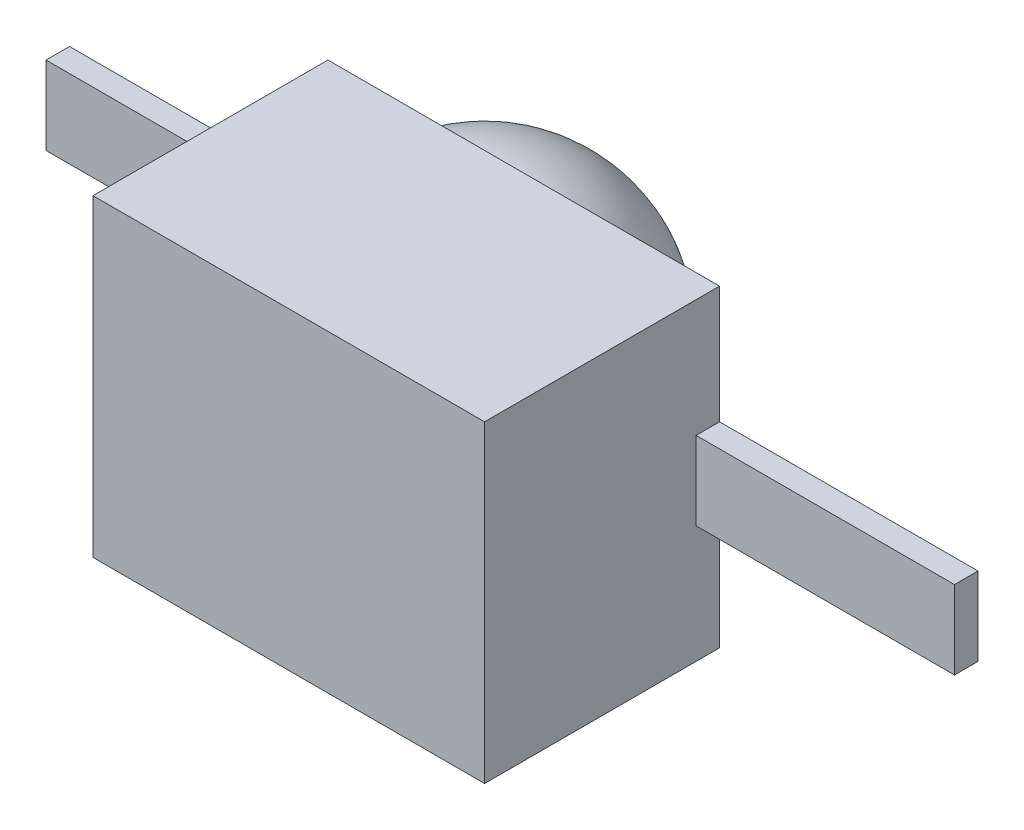
ISO-10303-21;
HEADER;
FILE_DESCRIPTION(('STEP AP214'),'2;1');
FILE_NAME('part.step','',(''),(''),'','','');
FILE_SCHEMA(('AUTOMOTIVE_DESIGN { 1 0 10303 214 1 1 1 1 }'));
ENDSEC;
DATA;
#1=APPLICATION_CONTEXT('core data for automotive mechanical design processes');
#2=APPLICATION_PROTOCOL_DEFINITION('international standard','automotive_design',2000,#1);
#3=PRODUCT_CONTEXT('',#1,'mechanical');
#4=PRODUCT('Part','Part','',(#3));
#5=PRODUCT_RELATED_PRODUCT_CATEGORY('part','',(#4));
#6=PRODUCT_DEFINITION_FORMATION('','',#4);
#7=PRODUCT_DEFINITION_CONTEXT('part definition',#1,'design');
#8=PRODUCT_DEFINITION('design','',#6,#7);
#9=PRODUCT_DEFINITION_SHAPE('','',#8);
#10=(LENGTH_UNIT() NAMED_UNIT(*) SI_UNIT(.MILLI.,.METRE.));
#11=(NAMED_UNIT(*) PLANE_ANGLE_UNIT() SI_UNIT($,.RADIAN.));
#12=(NAMED_UNIT(*) SI_UNIT($,.STERADIAN.) SOLID_ANGLE_UNIT());
#13=UNCERTAINTY_MEASURE_WITH_UNIT(LENGTH_MEASURE(1.E-05),#10,'distance_accuracy_value','');
#14=(GEOMETRIC_REPRESENTATION_CONTEXT(3) GLOBAL_UNCERTAINTY_ASSIGNED_CONTEXT((#13)) GLOBAL_UNIT_ASSIGNED_CONTEXT((#10,
#11,#12)) REPRESENTATION_CONTEXT('',''));
#15=CARTESIAN_POINT('',(0.,0.,0.));
#16=DIRECTION('',(0.,0.,1.));
#17=DIRECTION('',(1.,0.,0.));
#18=AXIS2_PLACEMENT_3D('',#15,#16,#17);
#19=CARTESIAN_POINT('',(-1.25,-1.,1.5));
#20=DIRECTION('',(1.,0.,0.));
#21=DIRECTION('',(0.,0.,-1.));
#22=AXIS2_PLACEMENT_3D('',#19,#20,#21);
#23=PLANE('',#22);
#24=DIRECTION('',(0.,0.,-1.));
#25=VECTOR('',#24,1.);
#26=CARTESIAN_POINT('',(-1.25,0.25,0.15));
#27=LINE('',#26,#25);
#28=CARTESIAN_POINT('',(-1.25,0.25,0.15));
#29=VERTEX_POINT('',#28);
#30=CARTESIAN_POINT('',(-1.25,0.25,0.));
#31=VERTEX_POINT('',#30);
#32=EDGE_CURVE('E48',#29,#31,#27,.T.);
#33=ORIENTED_EDGE('',*,*,#32,.F.);
#34=DIRECTION('',(0.,1.,0.));
#35=VECTOR('',#34,1.);
#36=CARTESIAN_POINT('',(-1.25,-0.25,0.15));
#37=LINE('',#36,#35);
#38=CARTESIAN_POINT('',(-1.25,-0.25,0.15));
#39=VERTEX_POINT('',#38);
#40=EDGE_CURVE('E223',#39,#29,#37,.T.);
#41=ORIENTED_EDGE('',*,*,#40,.F.);
#42=DIRECTION('',(0.,0.,1.));
#43=VECTOR('',#42,1.);
#44=CARTESIAN_POINT('',(-1.25,-0.25,0.15));
#45=LINE('',#44,#43);
#46=CARTESIAN_POINT('',(-1.25,-0.25,0.));
#47=VERTEX_POINT('',#46);
#48=EDGE_CURVE('E54',#47,#39,#45,.T.);
#49=ORIENTED_EDGE('',*,*,#48,.F.);
#50=DIRECTION('',(0.,-1.,0.));
#51=VECTOR('',#50,1.);
#52=CARTESIAN_POINT('',(-1.25,-1.,0.));
#53=LINE('',#52,#51);
#54=CARTESIAN_POINT('',(-1.25,-1.,0.));
#55=VERTEX_POINT('',#54);
#56=EDGE_CURVE('E144',#47,#55,#53,.T.);
#57=ORIENTED_EDGE('',*,*,#56,.T.);
#58=DIRECTION('',(0.,0.,-1.));
#59=VECTOR('',#58,1.);
#60=CARTESIAN_POINT('',(-1.25,-1.,1.5));
#61=LINE('',#60,#59);
#62=CARTESIAN_POINT('',(-1.25,-1.,1.5));
#63=VERTEX_POINT('',#62);
#64=EDGE_CURVE('E201',#63,#55,#61,.T.);
#65=ORIENTED_EDGE('',*,*,#64,.F.);
#66=DIRECTION('',(0.,-1.,0.));
#67=VECTOR('',#66,1.);
#68=CARTESIAN_POINT('',(-1.25,-1.,1.5));
#69=LINE('',#68,#67);
#70=CARTESIAN_POINT('',(-1.25,1.,1.5));
#71=VERTEX_POINT('',#70);
#72=EDGE_CURVE('E187',#71,#63,#69,.T.);
#73=ORIENTED_EDGE('',*,*,#72,.F.);
#74=DIRECTION('',(0.,0.,-1.));
#75=VECTOR('',#74,1.);
#76=CARTESIAN_POINT('',(-1.25,1.,1.5));
#77=LINE('',#76,#75);
#78=CARTESIAN_POINT('',(-1.25,1.,0.));
#79=VERTEX_POINT('',#78);
#80=EDGE_CURVE('E204',#71,#79,#77,.T.);
#81=ORIENTED_EDGE('',*,*,#80,.T.);
#82=EDGE_CURVE('E196',#79,#31,#53,.T.);
#83=ORIENTED_EDGE('',*,*,#82,.T.);
#84=EDGE_LOOP('',(#33,#41,#49,#57,#65,#73,#81,#83));
#85=FACE_BOUND('',#84,.T.);
#86=ADVANCED_FACE('F33',(#85),#23,.F.);
#87=CARTESIAN_POINT('',(1.25,-1.,1.5));
#88=DIRECTION('',(-1.,0.,0.));
#89=DIRECTION('',(0.,0.,1.));
#90=AXIS2_PLACEMENT_3D('',#87,#88,#89);
#91=PLANE('',#90);
#92=DIRECTION('',(0.,0.,-1.));
#93=VECTOR('',#92,1.);
#94=CARTESIAN_POINT('',(1.25,-0.25,0.15));
#95=LINE('',#94,#93);
#96=CARTESIAN_POINT('',(1.25,-0.25,0.15));
#97=VERTEX_POINT('',#96);
#98=CARTESIAN_POINT('',(1.25,-0.25,0.));
#99=VERTEX_POINT('',#98);
#100=EDGE_CURVE('E158',#97,#99,#95,.T.);
#101=ORIENTED_EDGE('',*,*,#100,.F.);
#102=DIRECTION('',(0.,-1.,0.));
#103=VECTOR('',#102,1.);
#104=CARTESIAN_POINT('',(1.25,0.25,0.15));
#105=LINE('',#104,#103);
#106=CARTESIAN_POINT('',(1.25,0.25,0.15));
#107=VERTEX_POINT('',#106);
#108=EDGE_CURVE('E148',#107,#97,#105,.T.);
#109=ORIENTED_EDGE('',*,*,#108,.F.);
#110=DIRECTION('',(0.,0.,1.));
#111=VECTOR('',#110,1.);
#112=CARTESIAN_POINT('',(1.25,0.25,0.15));
#113=LINE('',#112,#111);
#114=CARTESIAN_POINT('',(1.25,0.25,0.));
#115=VERTEX_POINT('',#114);
#116=EDGE_CURVE('E145',#115,#107,#113,.T.);
#117=ORIENTED_EDGE('',*,*,#116,.F.);
#118=DIRECTION('',(0.,1.,0.));
#119=VECTOR('',#118,1.);
#120=CARTESIAN_POINT('',(1.25,-1.,0.));
#121=LINE('',#120,#119);
#122=CARTESIAN_POINT('',(1.25,1.,0.));
#123=VERTEX_POINT('',#122);
#124=EDGE_CURVE('E180',#115,#123,#121,.T.);
#125=ORIENTED_EDGE('',*,*,#124,.T.);
#126=DIRECTION('',(0.,0.,-1.));
#127=VECTOR('',#126,1.);
#128=CARTESIAN_POINT('',(1.25,1.,1.5));
#129=LINE('',#128,#127);
#130=CARTESIAN_POINT('',(1.25,1.,1.5));
#131=VERTEX_POINT('',#130);
#132=EDGE_CURVE('E41',#131,#123,#129,.T.);
#133=ORIENTED_EDGE('',*,*,#132,.F.);
#134=DIRECTION('',(0.,1.,0.));
#135=VECTOR('',#134,1.);
#136=CARTESIAN_POINT('',(1.25,-1.,1.5));
#137=LINE('',#136,#135);
#138=CARTESIAN_POINT('',(1.25,-1.,1.5));
#139=VERTEX_POINT('',#138);
#140=EDGE_CURVE('E181',#139,#131,#137,.T.);
#141=ORIENTED_EDGE('',*,*,#140,.F.);
#142=DIRECTION('',(0.,0.,-1.));
#143=VECTOR('',#142,1.);
#144=CARTESIAN_POINT('',(1.25,-1.,1.5));
#145=LINE('',#144,#143);
#146=CARTESIAN_POINT('',(1.25,-1.,0.));
#147=VERTEX_POINT('',#146);
#148=EDGE_CURVE('E191',#139,#147,#145,.T.);
#149=ORIENTED_EDGE('',*,*,#148,.T.);
#150=EDGE_CURVE('E192',#147,#99,#121,.T.);
#151=ORIENTED_EDGE('',*,*,#150,.T.);
#152=EDGE_LOOP('',(#101,#109,#117,#125,#133,#141,#149,#151));
#153=FACE_BOUND('',#152,.T.);
#154=ADVANCED_FACE('F35',(#153),#91,.F.);
#155=CARTESIAN_POINT('',(-1.25,1.,1.5));
#156=DIRECTION('',(0.,-1.,0.));
#157=DIRECTION('',(0.,0.,-1.));
#158=AXIS2_PLACEMENT_3D('',#155,#156,#157);
#159=PLANE('',#158);
#160=DIRECTION('',(-1.,0.,0.));
#161=VECTOR('',#160,1.);
#162=CARTESIAN_POINT('',(-1.25,1.,0.));
#163=LINE('',#162,#161);
#164=EDGE_CURVE('E194',#123,#79,#163,.T.);
#165=ORIENTED_EDGE('',*,*,#164,.T.);
#166=ORIENTED_EDGE('',*,*,#80,.F.);
#167=DIRECTION('',(-1.,0.,0.));
#168=VECTOR('',#167,1.);
#169=CARTESIAN_POINT('',(-1.25,1.,1.5));
#170=LINE('',#169,#168);
#171=EDGE_CURVE('E184',#131,#71,#170,.T.);
#172=ORIENTED_EDGE('',*,*,#171,.F.);
#173=ORIENTED_EDGE('',*,*,#132,.T.);
#174=EDGE_LOOP('',(#165,#166,#172,#173));
#175=FACE_BOUND('',#174,.T.);
#176=ADVANCED_FACE('F209',(#175),#159,.F.);
#177=CARTESIAN_POINT('',(-1.25,-1.,1.5));
#178=DIRECTION('',(0.,1.,0.));
#179=DIRECTION('',(0.,0.,1.));
#180=AXIS2_PLACEMENT_3D('',#177,#178,#179);
#181=PLANE('',#180);
#182=DIRECTION('',(1.,0.,0.));
#183=VECTOR('',#182,1.);
#184=CARTESIAN_POINT('',(-1.25,-1.,0.));
#185=LINE('',#184,#183);
#186=EDGE_CURVE('E185',#55,#147,#185,.T.);
#187=ORIENTED_EDGE('',*,*,#186,.T.);
#188=ORIENTED_EDGE('',*,*,#148,.F.);
#189=DIRECTION('',(1.,0.,0.));
#190=VECTOR('',#189,1.);
#191=CARTESIAN_POINT('',(-1.25,-1.,1.5));
#192=LINE('',#191,#190);
#193=EDGE_CURVE('E189',#63,#139,#192,.T.);
#194=ORIENTED_EDGE('',*,*,#193,.F.);
#195=ORIENTED_EDGE('',*,*,#64,.T.);
#196=EDGE_LOOP('',(#187,#188,#194,#195));
#197=FACE_BOUND('',#196,.T.);
#198=ADVANCED_FACE('F247',(#197),#181,.F.);
#199=CARTESIAN_POINT('',(0.,0.,1.5));
#200=DIRECTION('',(0.,0.,-1.));
#201=DIRECTION('',(-1.,0.,0.));
#202=AXIS2_PLACEMENT_3D('',#199,#200,#201);
#203=PLANE('',#202);
#204=ORIENTED_EDGE('',*,*,#140,.T.);
#205=ORIENTED_EDGE('',*,*,#171,.T.);
#206=ORIENTED_EDGE('',*,*,#72,.T.);
#207=ORIENTED_EDGE('',*,*,#193,.T.);
#208=EDGE_LOOP('',(#204,#205,#206,#207));
#209=FACE_BOUND('',#208,.T.);
#210=ADVANCED_FACE('F253',(#209),#203,.F.);
#211=CARTESIAN_POINT('',(0.,0.,0.));
#212=DIRECTION('',(0.,0.,-1.));
#213=DIRECTION('',(-1.,0.,0.));
#214=AXIS2_PLACEMENT_3D('',#211,#212,#213);
#215=PLANE('',#214);
#216=CARTESIAN_POINT('',(-0.25,0.,0.));
#217=DIRECTION('',(0.,0.,-1.));
#218=DIRECTION('',(-1.,0.,0.));
#219=AXIS2_PLACEMENT_3D('',#216,#217,#218);
#220=CIRCLE('',#219,0.95);
#221=CARTESIAN_POINT('',(-1.2,0.,0.));
#222=VERTEX_POINT('',#221);
#223=EDGE_CURVE('E11',#222,#222,#220,.T.);
#224=ORIENTED_EDGE('',*,*,#223,.F.);
#225=EDGE_LOOP('',(#224));
#226=FACE_BOUND('',#225,.T.);
#227=ORIENTED_EDGE('',*,*,#150,.F.);
#228=ORIENTED_EDGE('',*,*,#186,.F.);
#229=ORIENTED_EDGE('',*,*,#56,.F.);
#230=DIRECTION('',(1.,0.,0.));
#231=VECTOR('',#230,1.);
#232=CARTESIAN_POINT('',(-2.9,-0.25,0.));
#233=LINE('',#232,#231);
#234=CARTESIAN_POINT('',(-2.9,-0.25,0.));
#235=VERTEX_POINT('',#234);
#236=EDGE_CURVE('E125',#235,#47,#233,.T.);
#237=ORIENTED_EDGE('',*,*,#236,.F.);
#238=DIRECTION('',(0.,-1.,0.));
#239=VECTOR('',#238,1.);
#240=CARTESIAN_POINT('',(-2.9,-0.25,0.));
#241=LINE('',#240,#239);
#242=CARTESIAN_POINT('',(-2.9,0.25,0.));
#243=VERTEX_POINT('',#242);
#244=EDGE_CURVE('E131',#243,#235,#241,.T.);
#245=ORIENTED_EDGE('',*,*,#244,.F.);
#246=DIRECTION('',(1.,0.,0.));
#247=VECTOR('',#246,1.);
#248=CARTESIAN_POINT('',(-2.9,0.25,0.));
#249=LINE('',#248,#247);
#250=EDGE_CURVE('E217',#243,#31,#249,.T.);
#251=ORIENTED_EDGE('',*,*,#250,.T.);
#252=ORIENTED_EDGE('',*,*,#82,.F.);
#253=ORIENTED_EDGE('',*,*,#164,.F.);
#254=ORIENTED_EDGE('',*,*,#124,.F.);
#255=DIRECTION('',(-1.,0.,0.));
#256=VECTOR('',#255,1.);
#257=CARTESIAN_POINT('',(2.9,0.25,0.));
#258=LINE('',#257,#256);
#259=CARTESIAN_POINT('',(2.9,0.25,0.));
#260=VERTEX_POINT('',#259);
#261=EDGE_CURVE('E177',#260,#115,#258,.T.);
#262=ORIENTED_EDGE('',*,*,#261,.F.);
#263=DIRECTION('',(0.,1.,0.));
#264=VECTOR('',#263,1.);
#265=CARTESIAN_POINT('',(2.9,0.25,0.));
#266=LINE('',#265,#264);
#267=CARTESIAN_POINT('',(2.9,-0.25,0.));
#268=VERTEX_POINT('',#267);
#269=EDGE_CURVE('E154',#268,#260,#266,.T.);
#270=ORIENTED_EDGE('',*,*,#269,.F.);
#271=DIRECTION('',(-1.,0.,0.));
#272=VECTOR('',#271,1.);
#273=CARTESIAN_POINT('',(2.9,-0.25,0.));
#274=LINE('',#273,#272);
#275=EDGE_CURVE('E163',#268,#99,#274,.T.);
#276=ORIENTED_EDGE('',*,*,#275,.T.);
#277=EDGE_LOOP('',(#227,#228,#229,#237,#245,#251,#252,#253,#254,#262,#270,#276));
#278=FACE_BOUND('',#277,.T.);
#279=ADVANCED_FACE('F142',(#226,#278),#215,.T.);
#280=CARTESIAN_POINT('',(2.9,0.25,0.15));
#281=DIRECTION('',(0.,-1.,0.));
#282=DIRECTION('',(0.,0.,-1.));
#283=AXIS2_PLACEMENT_3D('',#280,#281,#282);
#284=PLANE('',#283);
#285=ORIENTED_EDGE('',*,*,#116,.T.);
#286=DIRECTION('',(-1.,0.,0.));
#287=VECTOR('',#286,1.);
#288=CARTESIAN_POINT('',(2.9,0.25,0.15));
#289=LINE('',#288,#287);
#290=CARTESIAN_POINT('',(2.9,0.25,0.15));
#291=VERTEX_POINT('',#290);
#292=EDGE_CURVE('E174',#291,#107,#289,.T.);
#293=ORIENTED_EDGE('',*,*,#292,.F.);
#294=DIRECTION('',(0.,0.,1.));
#295=VECTOR('',#294,1.);
#296=CARTESIAN_POINT('',(2.9,0.25,0.15));
#297=LINE('',#296,#295);
#298=EDGE_CURVE('E157',#260,#291,#297,.T.);
#299=ORIENTED_EDGE('',*,*,#298,.F.);
#300=ORIENTED_EDGE('',*,*,#261,.T.);
#301=EDGE_LOOP('',(#285,#293,#299,#300));
#302=FACE_BOUND('',#301,.T.);
#303=ADVANCED_FACE('F274',(#302),#284,.F.);
#304=CARTESIAN_POINT('',(2.9,0.25,0.15));
#305=DIRECTION('',(0.,0.,-1.));
#306=DIRECTION('',(0.,1.,0.));
#307=AXIS2_PLACEMENT_3D('',#304,#305,#306);
#308=PLANE('',#307);
#309=ORIENTED_EDGE('',*,*,#108,.T.);
#310=DIRECTION('',(-1.,0.,0.));
#311=VECTOR('',#310,1.);
#312=CARTESIAN_POINT('',(2.9,-0.25,0.15));
#313=LINE('',#312,#311);
#314=CARTESIAN_POINT('',(2.9,-0.25,0.15));
#315=VERTEX_POINT('',#314);
#316=EDGE_CURVE('E171',#315,#97,#313,.T.);
#317=ORIENTED_EDGE('',*,*,#316,.F.);
#318=DIRECTION('',(0.,-1.,0.));
#319=VECTOR('',#318,1.);
#320=CARTESIAN_POINT('',(2.9,0.25,0.15));
#321=LINE('',#320,#319);
#322=EDGE_CURVE('E160',#291,#315,#321,.T.);
#323=ORIENTED_EDGE('',*,*,#322,.F.);
#324=ORIENTED_EDGE('',*,*,#292,.T.);
#325=EDGE_LOOP('',(#309,#317,#323,#324));
#326=FACE_BOUND('',#325,.T.);
#327=ADVANCED_FACE('F270',(#326),#308,.F.);
#328=CARTESIAN_POINT('',(2.9,-0.25,0.15));
#329=DIRECTION('',(0.,1.,0.));
#330=DIRECTION('',(0.,0.,1.));
#331=AXIS2_PLACEMENT_3D('',#328,#329,#330);
#332=PLANE('',#331);
#333=ORIENTED_EDGE('',*,*,#100,.T.);
#334=ORIENTED_EDGE('',*,*,#275,.F.);
#335=DIRECTION('',(0.,0.,-1.));
#336=VECTOR('',#335,1.);
#337=CARTESIAN_POINT('',(2.9,-0.25,0.15));
#338=LINE('',#337,#336);
#339=EDGE_CURVE('E162',#315,#268,#338,.T.);
#340=ORIENTED_EDGE('',*,*,#339,.F.);
#341=ORIENTED_EDGE('',*,*,#316,.T.);
#342=EDGE_LOOP('',(#333,#334,#340,#341));
#343=FACE_BOUND('',#342,.T.);
#344=ADVANCED_FACE('F267',(#343),#332,.F.);
#345=CARTESIAN_POINT('',(2.9,0.,0.));
#346=DIRECTION('',(1.,0.,0.));
#347=DIRECTION('',(0.,0.,-1.));
#348=AXIS2_PLACEMENT_3D('',#345,#346,#347);
#349=PLANE('',#348);
#350=ORIENTED_EDGE('',*,*,#269,.T.);
#351=ORIENTED_EDGE('',*,*,#298,.T.);
#352=ORIENTED_EDGE('',*,*,#322,.T.);
#353=ORIENTED_EDGE('',*,*,#339,.T.);
#354=EDGE_LOOP('',(#350,#351,#352,#353));
#355=FACE_BOUND('',#354,.T.);
#356=ADVANCED_FACE('F239',(#355),#349,.T.);
#357=CARTESIAN_POINT('',(-2.9,-0.25,0.15));
#358=DIRECTION('',(0.,1.,0.));
#359=DIRECTION('',(0.,0.,1.));
#360=AXIS2_PLACEMENT_3D('',#357,#358,#359);
#361=PLANE('',#360);
#362=ORIENTED_EDGE('',*,*,#48,.T.);
#363=DIRECTION('',(1.,0.,0.));
#364=VECTOR('',#363,1.);
#365=CARTESIAN_POINT('',(-2.9,-0.25,0.15));
#366=LINE('',#365,#364);
#367=CARTESIAN_POINT('',(-2.9,-0.25,0.15));
#368=VERTEX_POINT('',#367);
#369=EDGE_CURVE('E127',#368,#39,#366,.T.);
#370=ORIENTED_EDGE('',*,*,#369,.F.);
#371=DIRECTION('',(0.,0.,1.));
#372=VECTOR('',#371,1.);
#373=CARTESIAN_POINT('',(-2.9,-0.25,0.15));
#374=LINE('',#373,#372);
#375=EDGE_CURVE('E121',#235,#368,#374,.T.);
#376=ORIENTED_EDGE('',*,*,#375,.F.);
#377=ORIENTED_EDGE('',*,*,#236,.T.);
#378=EDGE_LOOP('',(#362,#370,#376,#377));
#379=FACE_BOUND('',#378,.T.);
#380=ADVANCED_FACE('F123',(#379),#361,.F.);
#381=CARTESIAN_POINT('',(-2.9,-0.25,0.15));
#382=DIRECTION('',(0.,0.,-1.));
#383=DIRECTION('',(-1.,0.,0.));
#384=AXIS2_PLACEMENT_3D('',#381,#382,#383);
#385=PLANE('',#384);
#386=ORIENTED_EDGE('',*,*,#40,.T.);
#387=DIRECTION('',(1.,0.,0.));
#388=VECTOR('',#387,1.);
#389=CARTESIAN_POINT('',(-2.9,0.25,0.15));
#390=LINE('',#389,#388);
#391=CARTESIAN_POINT('',(-2.9,0.25,0.15));
#392=VERTEX_POINT('',#391);
#393=EDGE_CURVE('E150',#392,#29,#390,.T.);
#394=ORIENTED_EDGE('',*,*,#393,.F.);
#395=DIRECTION('',(0.,1.,0.));
#396=VECTOR('',#395,1.);
#397=CARTESIAN_POINT('',(-2.9,-0.25,0.15));
#398=LINE('',#397,#396);
#399=EDGE_CURVE('E130',#368,#392,#398,.T.);
#400=ORIENTED_EDGE('',*,*,#399,.F.);
#401=ORIENTED_EDGE('',*,*,#369,.T.);
#402=EDGE_LOOP('',(#386,#394,#400,#401));
#403=FACE_BOUND('',#402,.T.);
#404=ADVANCED_FACE('F231',(#403),#385,.F.);
#405=CARTESIAN_POINT('',(-2.9,0.25,0.15));
#406=DIRECTION('',(0.,-1.,0.));
#407=DIRECTION('',(0.,0.,-1.));
#408=AXIS2_PLACEMENT_3D('',#405,#406,#407);
#409=PLANE('',#408);
#410=ORIENTED_EDGE('',*,*,#32,.T.);
#411=ORIENTED_EDGE('',*,*,#250,.F.);
#412=DIRECTION('',(0.,0.,-1.));
#413=VECTOR('',#412,1.);
#414=CARTESIAN_POINT('',(-2.9,0.25,0.15));
#415=LINE('',#414,#413);
#416=EDGE_CURVE('E136',#392,#243,#415,.T.);
#417=ORIENTED_EDGE('',*,*,#416,.F.);
#418=ORIENTED_EDGE('',*,*,#393,.T.);
#419=EDGE_LOOP('',(#410,#411,#417,#418));
#420=FACE_BOUND('',#419,.T.);
#421=ADVANCED_FACE('F221',(#420),#409,.F.);
#422=CARTESIAN_POINT('',(-2.9,0.,0.));
#423=DIRECTION('',(-1.,0.,0.));
#424=DIRECTION('',(0.,0.,1.));
#425=AXIS2_PLACEMENT_3D('',#422,#423,#424);
#426=PLANE('',#425);
#427=ORIENTED_EDGE('',*,*,#244,.T.);
#428=ORIENTED_EDGE('',*,*,#375,.T.);
#429=ORIENTED_EDGE('',*,*,#399,.T.);
#430=ORIENTED_EDGE('',*,*,#416,.T.);
#431=EDGE_LOOP('',(#427,#428,#429,#430));
#432=FACE_BOUND('',#431,.T.);
#433=ADVANCED_FACE('F134',(#432),#426,.T.);
#434=CARTESIAN_POINT('',(-0.25,0.,0.));
#435=DIRECTION('',(-1.,0.,0.));
#436=DIRECTION('',(0.,-1.,0.));
#437=AXIS2_PLACEMENT_3D('',#434,#435,#436);
#438=SPHERICAL_SURFACE('',#437,0.95);
#439=CARTESIAN_POINT('',(-0.25,0.,0.));
#440=DIRECTION('',(0.,0.,-1.));
#441=DIRECTION('',(-1.,0.,0.));
#442=AXIS2_PLACEMENT_3D('',#439,#440,#441);
#443=SPHERICAL_SURFACE('',#442,0.95);
#444=ORIENTED_EDGE('',*,*,#223,.T.);
#445=EDGE_LOOP('',(#444));
#446=FACE_BOUND('',#445,.T.);
#447=ADVANCED_FACE('F292',(#446),#443,.T.);
#448=CLOSED_SHELL('',(#86,#154,#176,#198,#210,#279,#303,#327,#344,#356,#380,#404,#421,#433,#447));
#449=MANIFOLD_SOLID_BREP('B2',#448);
#450=ADVANCED_BREP_SHAPE_REPRESENTATION('',(#18,#449),#14);
#451=SHAPE_DEFINITION_REPRESENTATION(#9,#450);
ENDSEC;
END-ISO-10303-21;
